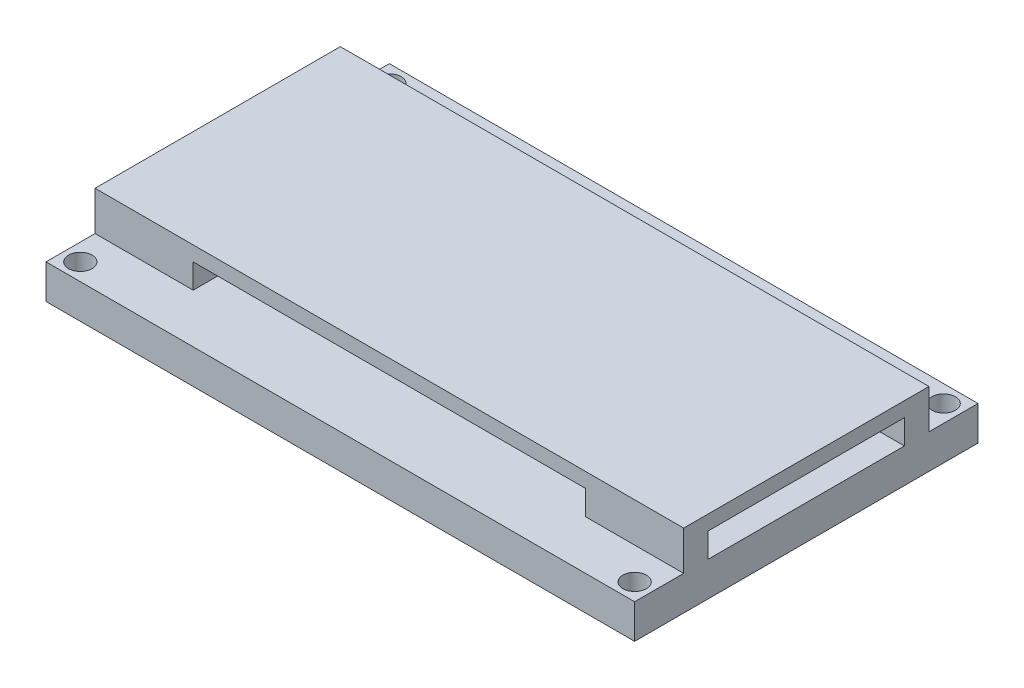
ISO-10303-21;
HEADER;
FILE_DESCRIPTION(('STEP AP214'),'2;1');
FILE_NAME('part.step','',(''),(''),'','','');
FILE_SCHEMA(('AUTOMOTIVE_DESIGN { 1 0 10303 214 1 1 1 1 }'));
ENDSEC;
DATA;
#1=APPLICATION_CONTEXT('core data for automotive mechanical design processes');
#2=APPLICATION_PROTOCOL_DEFINITION('international standard','automotive_design',2000,#1);
#3=PRODUCT_CONTEXT('',#1,'mechanical');
#4=PRODUCT('Part','Part','',(#3));
#5=PRODUCT_RELATED_PRODUCT_CATEGORY('part','',(#4));
#6=PRODUCT_DEFINITION_FORMATION('','',#4);
#7=PRODUCT_DEFINITION_CONTEXT('part definition',#1,'design');
#8=PRODUCT_DEFINITION('design','',#6,#7);
#9=PRODUCT_DEFINITION_SHAPE('','',#8);
#10=(LENGTH_UNIT() NAMED_UNIT(*) SI_UNIT(.MILLI.,.METRE.));
#11=(NAMED_UNIT(*) PLANE_ANGLE_UNIT() SI_UNIT($,.RADIAN.));
#12=(NAMED_UNIT(*) SI_UNIT($,.STERADIAN.) SOLID_ANGLE_UNIT());
#13=UNCERTAINTY_MEASURE_WITH_UNIT(LENGTH_MEASURE(1.E-05),#10,'distance_accuracy_value','');
#14=(GEOMETRIC_REPRESENTATION_CONTEXT(3) GLOBAL_UNCERTAINTY_ASSIGNED_CONTEXT((#13)) GLOBAL_UNIT_ASSIGNED_CONTEXT((#10,
#11,#12)) REPRESENTATION_CONTEXT('',''));
#15=CARTESIAN_POINT('',(0.,0.,0.));
#16=DIRECTION('',(0.,0.,1.));
#17=DIRECTION('',(1.,0.,0.));
#18=AXIS2_PLACEMENT_3D('',#15,#16,#17);
#19=CARTESIAN_POINT('',(60.,12.,-20.));
#20=DIRECTION('',(0.,0.,-1.));
#21=DIRECTION('',(-1.,0.,0.));
#22=AXIS2_PLACEMENT_3D('',#19,#20,#21);
#23=PLANE('',#22);
#24=DIRECTION('',(1.,0.,0.));
#25=VECTOR('',#24,1.);
#26=CARTESIAN_POINT('',(60.,7.,-20.));
#27=LINE('',#26,#25);
#28=CARTESIAN_POINT('',(-60.,7.,-20.));
#29=VERTEX_POINT('',#28);
#30=CARTESIAN_POINT('',(-40.,7.,-20.));
#31=VERTEX_POINT('',#30);
#32=EDGE_CURVE('E236',#29,#31,#27,.T.);
#33=ORIENTED_EDGE('',*,*,#32,.T.);
#34=DIRECTION('',(0.,1.,0.));
#35=VECTOR('',#34,1.);
#36=CARTESIAN_POINT('',(-40.,12.,-20.));
#37=LINE('',#36,#35);
#38=CARTESIAN_POINT('',(-40.,12.,-20.));
#39=VERTEX_POINT('',#38);
#40=EDGE_CURVE('E403',#31,#39,#37,.T.);
#41=ORIENTED_EDGE('',*,*,#40,.T.);
#42=DIRECTION('',(1.,0.,0.));
#43=VECTOR('',#42,1.);
#44=CARTESIAN_POINT('',(60.,12.,-20.));
#45=LINE('',#44,#43);
#46=CARTESIAN_POINT('',(-60.,12.,-20.));
#47=VERTEX_POINT('',#46);
#48=EDGE_CURVE('E230',#47,#39,#45,.T.);
#49=ORIENTED_EDGE('',*,*,#48,.F.);
#50=DIRECTION('',(0.,-1.,0.));
#51=VECTOR('',#50,1.);
#52=CARTESIAN_POINT('',(-60.,12.,-20.));
#53=LINE('',#52,#51);
#54=EDGE_CURVE('E256',#47,#29,#53,.T.);
#55=ORIENTED_EDGE('',*,*,#54,.T.);
#56=EDGE_LOOP('',(#33,#41,#49,#55));
#57=FACE_BOUND('',#56,.T.);
#58=ADVANCED_FACE('F39',(#57),#23,.F.);
#59=CARTESIAN_POINT('',(60.,12.,20.));
#60=DIRECTION('',(0.,0.,1.));
#61=DIRECTION('',(1.,0.,0.));
#62=AXIS2_PLACEMENT_3D('',#59,#60,#61);
#63=PLANE('',#62);
#64=DIRECTION('',(-1.,0.,0.));
#65=VECTOR('',#64,1.);
#66=CARTESIAN_POINT('',(60.,12.,20.));
#67=LINE('',#66,#65);
#68=CARTESIAN_POINT('',(-40.,12.,20.));
#69=VERTEX_POINT('',#68);
#70=CARTESIAN_POINT('',(-60.,12.,20.));
#71=VERTEX_POINT('',#70);
#72=EDGE_CURVE('E210',#69,#71,#67,.T.);
#73=ORIENTED_EDGE('',*,*,#72,.F.);
#74=DIRECTION('',(0.,-1.,0.));
#75=VECTOR('',#74,1.);
#76=CARTESIAN_POINT('',(-40.,12.,20.));
#77=LINE('',#76,#75);
#78=CARTESIAN_POINT('',(-40.,7.,20.));
#79=VERTEX_POINT('',#78);
#80=EDGE_CURVE('E424',#69,#79,#77,.T.);
#81=ORIENTED_EDGE('',*,*,#80,.T.);
#82=DIRECTION('',(-1.,0.,0.));
#83=VECTOR('',#82,1.);
#84=CARTESIAN_POINT('',(60.,7.,20.));
#85=LINE('',#84,#83);
#86=CARTESIAN_POINT('',(-60.,7.,20.));
#87=VERTEX_POINT('',#86);
#88=EDGE_CURVE('E211',#79,#87,#85,.T.);
#89=ORIENTED_EDGE('',*,*,#88,.T.);
#90=DIRECTION('',(0.,-1.,0.));
#91=VECTOR('',#90,1.);
#92=CARTESIAN_POINT('',(-60.,12.,20.));
#93=LINE('',#92,#91);
#94=EDGE_CURVE('E222',#71,#87,#93,.T.);
#95=ORIENTED_EDGE('',*,*,#94,.F.);
#96=EDGE_LOOP('',(#73,#81,#89,#95));
#97=FACE_BOUND('',#96,.T.);
#98=ADVANCED_FACE('F395',(#97),#63,.F.);
#99=CARTESIAN_POINT('',(0.,7.,0.));
#100=DIRECTION('',(0.,1.,0.));
#101=DIRECTION('',(0.,0.,1.));
#102=AXIS2_PLACEMENT_3D('',#99,#100,#101);
#103=PLANE('',#102);
#104=DIRECTION('',(-1.,0.,0.));
#105=VECTOR('',#104,1.);
#106=CARTESIAN_POINT('',(-60.,7.,-35.));
#107=LINE('',#106,#105);
#108=CARTESIAN_POINT('',(60.,7.,-35.));
#109=VERTEX_POINT('',#108);
#110=CARTESIAN_POINT('',(-60.,7.,-35.));
#111=VERTEX_POINT('',#110);
#112=EDGE_CURVE('E295',#109,#111,#107,.T.);
#113=ORIENTED_EDGE('',*,*,#112,.T.);
#114=DIRECTION('',(0.,0.,1.));
#115=VECTOR('',#114,1.);
#116=CARTESIAN_POINT('',(-60.,7.,-35.));
#117=LINE('',#116,#115);
#118=CARTESIAN_POINT('',(-60.,7.,-25.));
#119=VERTEX_POINT('',#118);
#120=EDGE_CURVE('E301',#111,#119,#117,.T.);
#121=ORIENTED_EDGE('',*,*,#120,.T.);
#122=DIRECTION('',(-1.,0.,0.));
#123=VECTOR('',#122,1.);
#124=CARTESIAN_POINT('',(-60.,7.,-25.));
#125=LINE('',#124,#123);
#126=CARTESIAN_POINT('',(-40.,7.,-25.));
#127=VERTEX_POINT('',#126);
#128=EDGE_CURVE('E240',#127,#119,#125,.T.);
#129=ORIENTED_EDGE('',*,*,#128,.F.);
#130=DIRECTION('',(0.,0.,1.));
#131=VECTOR('',#130,1.);
#132=CARTESIAN_POINT('',(-40.,7.,-35.));
#133=LINE('',#132,#131);
#134=EDGE_CURVE('E55',#127,#31,#133,.T.);
#135=ORIENTED_EDGE('',*,*,#134,.T.);
#136=ORIENTED_EDGE('',*,*,#32,.F.);
#137=EDGE_CURVE('E306',#29,#87,#117,.T.);
#138=ORIENTED_EDGE('',*,*,#137,.T.);
#139=ORIENTED_EDGE('',*,*,#88,.F.);
#140=CARTESIAN_POINT('',(-40.,7.,25.));
#141=VERTEX_POINT('',#140);
#142=EDGE_CURVE('E435',#79,#141,#133,.T.);
#143=ORIENTED_EDGE('',*,*,#142,.T.);
#144=DIRECTION('',(1.,0.,0.));
#145=VECTOR('',#144,1.);
#146=CARTESIAN_POINT('',(-60.,7.,25.));
#147=LINE('',#146,#145);
#148=CARTESIAN_POINT('',(-60.,7.,25.));
#149=VERTEX_POINT('',#148);
#150=EDGE_CURVE('E205',#149,#141,#147,.T.);
#151=ORIENTED_EDGE('',*,*,#150,.F.);
#152=CARTESIAN_POINT('',(-60.,7.,35.));
#153=VERTEX_POINT('',#152);
#154=EDGE_CURVE('E300',#149,#153,#117,.T.);
#155=ORIENTED_EDGE('',*,*,#154,.T.);
#156=DIRECTION('',(1.,0.,0.));
#157=VECTOR('',#156,1.);
#158=CARTESIAN_POINT('',(-60.,7.,35.));
#159=LINE('',#158,#157);
#160=CARTESIAN_POINT('',(60.,7.,35.));
#161=VERTEX_POINT('',#160);
#162=EDGE_CURVE('E305',#153,#161,#159,.T.);
#163=ORIENTED_EDGE('',*,*,#162,.T.);
#164=DIRECTION('',(0.,0.,-1.));
#165=VECTOR('',#164,1.);
#166=CARTESIAN_POINT('',(60.,7.,-35.));
#167=LINE('',#166,#165);
#168=CARTESIAN_POINT('',(60.,7.,25.));
#169=VERTEX_POINT('',#168);
#170=EDGE_CURVE('E203',#161,#169,#167,.T.);
#171=ORIENTED_EDGE('',*,*,#170,.T.);
#172=CARTESIAN_POINT('',(40.,7.,25.));
#173=VERTEX_POINT('',#172);
#174=EDGE_CURVE('E191',#173,#169,#147,.T.);
#175=ORIENTED_EDGE('',*,*,#174,.F.);
#176=DIRECTION('',(0.,0.,1.));
#177=VECTOR('',#176,1.);
#178=CARTESIAN_POINT('',(40.,7.,-35.));
#179=LINE('',#178,#177);
#180=CARTESIAN_POINT('',(40.,7.,20.));
#181=VERTEX_POINT('',#180);
#182=EDGE_CURVE('E176',#181,#173,#179,.T.);
#183=ORIENTED_EDGE('',*,*,#182,.F.);
#184=CARTESIAN_POINT('',(60.,7.,20.));
#185=VERTEX_POINT('',#184);
#186=EDGE_CURVE('E206',#185,#181,#85,.T.);
#187=ORIENTED_EDGE('',*,*,#186,.F.);
#188=CARTESIAN_POINT('',(60.,7.,-20.));
#189=VERTEX_POINT('',#188);
#190=EDGE_CURVE('E296',#185,#189,#167,.T.);
#191=ORIENTED_EDGE('',*,*,#190,.T.);
#192=CARTESIAN_POINT('',(40.,7.,-20.));
#193=VERTEX_POINT('',#192);
#194=EDGE_CURVE('E229',#193,#189,#27,.T.);
#195=ORIENTED_EDGE('',*,*,#194,.F.);
#196=CARTESIAN_POINT('',(40.,7.,-25.));
#197=VERTEX_POINT('',#196);
#198=EDGE_CURVE('E62',#197,#193,#179,.T.);
#199=ORIENTED_EDGE('',*,*,#198,.F.);
#200=CARTESIAN_POINT('',(60.,7.,-25.));
#201=VERTEX_POINT('',#200);
#202=EDGE_CURVE('E241',#201,#197,#125,.T.);
#203=ORIENTED_EDGE('',*,*,#202,.F.);
#204=EDGE_CURVE('E297',#201,#109,#167,.T.);
#205=ORIENTED_EDGE('',*,*,#204,.T.);
#206=EDGE_LOOP('',(#113,#121,#129,#135,#136,#138,#139,#143,#151,#155,#163,#171,#175,#183,#187,
#191,#195,#199,#203,#205));
#207=FACE_BOUND('',#206,.T.);
#208=CARTESIAN_POINT('',(56.5,7.,-31.5));
#209=DIRECTION('',(0.,1.,0.));
#210=DIRECTION('',(0.,0.,1.));
#211=AXIS2_PLACEMENT_3D('',#208,#209,#210);
#212=CIRCLE('',#211,2.39999999999999);
#213=CARTESIAN_POINT('',(56.5,7.,-29.1));
#214=VERTEX_POINT('',#213);
#215=EDGE_CURVE('E260',#214,#214,#212,.T.);
#216=ORIENTED_EDGE('',*,*,#215,.F.);
#217=EDGE_LOOP('',(#216));
#218=FACE_BOUND('',#217,.T.);
#219=CARTESIAN_POINT('',(56.5,7.,31.5));
#220=DIRECTION('',(0.,1.,0.));
#221=DIRECTION('',(0.,0.,1.));
#222=AXIS2_PLACEMENT_3D('',#219,#220,#221);
#223=CIRCLE('',#222,2.39999999999999);
#224=CARTESIAN_POINT('',(56.5,7.,33.9));
#225=VERTEX_POINT('',#224);
#226=EDGE_CURVE('E268',#225,#225,#223,.T.);
#227=ORIENTED_EDGE('',*,*,#226,.F.);
#228=EDGE_LOOP('',(#227));
#229=FACE_BOUND('',#228,.T.);
#230=CARTESIAN_POINT('',(-56.5,7.,31.5));
#231=DIRECTION('',(0.,1.,0.));
#232=DIRECTION('',(0.,0.,1.));
#233=AXIS2_PLACEMENT_3D('',#230,#231,#232);
#234=CIRCLE('',#233,2.39999999999999);
#235=CARTESIAN_POINT('',(-56.5,7.,33.9));
#236=VERTEX_POINT('',#235);
#237=EDGE_CURVE('E276',#236,#236,#234,.T.);
#238=ORIENTED_EDGE('',*,*,#237,.F.);
#239=EDGE_LOOP('',(#238));
#240=FACE_BOUND('',#239,.T.);
#241=CARTESIAN_POINT('',(-56.5,7.,-31.5));
#242=DIRECTION('',(0.,1.,0.));
#243=DIRECTION('',(0.,0.,1.));
#244=AXIS2_PLACEMENT_3D('',#241,#242,#243);
#245=CIRCLE('',#244,2.39999999999999);
#246=CARTESIAN_POINT('',(-56.5,7.,-29.1));
#247=VERTEX_POINT('',#246);
#248=EDGE_CURVE('E284',#247,#247,#245,.T.);
#249=ORIENTED_EDGE('',*,*,#248,.F.);
#250=EDGE_LOOP('',(#249));
#251=FACE_BOUND('',#250,.T.);
#252=ADVANCED_FACE('F200',(#207,#218,#229,#240,#251),#103,.T.);
#253=CARTESIAN_POINT('',(60.,7.,-35.));
#254=DIRECTION('',(-1.,0.,0.));
#255=DIRECTION('',(0.,0.,1.));
#256=AXIS2_PLACEMENT_3D('',#253,#254,#255);
#257=PLANE('',#256);
#258=DIRECTION('',(0.,-1.,0.));
#259=VECTOR('',#258,1.);
#260=CARTESIAN_POINT('',(60.,12.,-25.));
#261=LINE('',#260,#259);
#262=CARTESIAN_POINT('',(60.,15.,-25.));
#263=VERTEX_POINT('',#262);
#264=EDGE_CURVE('E248',#263,#201,#261,.T.);
#265=ORIENTED_EDGE('',*,*,#264,.F.);
#266=DIRECTION('',(0.,0.,-1.));
#267=VECTOR('',#266,1.);
#268=CARTESIAN_POINT('',(60.,15.,-25.));
#269=LINE('',#268,#267);
#270=CARTESIAN_POINT('',(60.,15.,25.));
#271=VERTEX_POINT('',#270);
#272=EDGE_CURVE('E351',#271,#263,#269,.T.);
#273=ORIENTED_EDGE('',*,*,#272,.F.);
#274=DIRECTION('',(0.,-1.,0.));
#275=VECTOR('',#274,1.);
#276=CARTESIAN_POINT('',(60.,12.,25.));
#277=LINE('',#276,#275);
#278=EDGE_CURVE('E215',#271,#169,#277,.T.);
#279=ORIENTED_EDGE('',*,*,#278,.T.);
#280=ORIENTED_EDGE('',*,*,#170,.F.);
#281=DIRECTION('',(0.,-1.,0.));
#282=VECTOR('',#281,1.);
#283=CARTESIAN_POINT('',(60.,7.,35.));
#284=LINE('',#283,#282);
#285=CARTESIAN_POINT('',(60.,0.,35.));
#286=VERTEX_POINT('',#285);
#287=EDGE_CURVE('E309',#161,#286,#284,.T.);
#288=ORIENTED_EDGE('',*,*,#287,.T.);
#289=DIRECTION('',(0.,0.,-1.));
#290=VECTOR('',#289,1.);
#291=CARTESIAN_POINT('',(60.,0.,-35.));
#292=LINE('',#291,#290);
#293=CARTESIAN_POINT('',(60.,0.,-35.));
#294=VERTEX_POINT('',#293);
#295=EDGE_CURVE('E292',#286,#294,#292,.T.);
#296=ORIENTED_EDGE('',*,*,#295,.T.);
#297=DIRECTION('',(0.,-1.,0.));
#298=VECTOR('',#297,1.);
#299=CARTESIAN_POINT('',(60.,7.,-35.));
#300=LINE('',#299,#298);
#301=EDGE_CURVE('E11',#109,#294,#300,.T.);
#302=ORIENTED_EDGE('',*,*,#301,.F.);
#303=ORIENTED_EDGE('',*,*,#204,.F.);
#304=EDGE_LOOP('',(#265,#273,#279,#280,#288,#296,#302,#303));
#305=FACE_BOUND('',#304,.T.);
#306=DIRECTION('',(0.,0.,-1.));
#307=VECTOR('',#306,1.);
#308=CARTESIAN_POINT('',(60.,12.,-25.));
#309=LINE('',#308,#307);
#310=CARTESIAN_POINT('',(60.,12.,20.));
#311=VERTEX_POINT('',#310);
#312=CARTESIAN_POINT('',(60.,12.,-20.));
#313=VERTEX_POINT('',#312);
#314=EDGE_CURVE('E368',#311,#313,#309,.T.);
#315=ORIENTED_EDGE('',*,*,#314,.T.);
#316=DIRECTION('',(0.,-1.,0.));
#317=VECTOR('',#316,1.);
#318=CARTESIAN_POINT('',(60.,12.,-20.));
#319=LINE('',#318,#317);
#320=EDGE_CURVE('E252',#313,#189,#319,.T.);
#321=ORIENTED_EDGE('',*,*,#320,.T.);
#322=ORIENTED_EDGE('',*,*,#190,.F.);
#323=DIRECTION('',(0.,-1.,0.));
#324=VECTOR('',#323,1.);
#325=CARTESIAN_POINT('',(60.,12.,20.));
#326=LINE('',#325,#324);
#327=EDGE_CURVE('E226',#311,#185,#326,.T.);
#328=ORIENTED_EDGE('',*,*,#327,.F.);
#329=EDGE_LOOP('',(#315,#321,#322,#328));
#330=FACE_BOUND('',#329,.T.);
#331=ADVANCED_FACE('F41',(#305,#330),#257,.F.);
#332=CARTESIAN_POINT('',(-60.,7.,-35.));
#333=DIRECTION('',(0.,0.,1.));
#334=DIRECTION('',(1.,0.,0.));
#335=AXIS2_PLACEMENT_3D('',#332,#333,#334);
#336=PLANE('',#335);
#337=DIRECTION('',(-1.,0.,0.));
#338=VECTOR('',#337,1.);
#339=CARTESIAN_POINT('',(-60.,0.,-35.));
#340=LINE('',#339,#338);
#341=CARTESIAN_POINT('',(-60.,0.,-35.));
#342=VERTEX_POINT('',#341);
#343=EDGE_CURVE('E313',#294,#342,#340,.T.);
#344=ORIENTED_EDGE('',*,*,#343,.T.);
#345=DIRECTION('',(0.,-1.,0.));
#346=VECTOR('',#345,1.);
#347=CARTESIAN_POINT('',(-60.,7.,-35.));
#348=LINE('',#347,#346);
#349=EDGE_CURVE('E48',#111,#342,#348,.T.);
#350=ORIENTED_EDGE('',*,*,#349,.F.);
#351=ORIENTED_EDGE('',*,*,#112,.F.);
#352=ORIENTED_EDGE('',*,*,#301,.T.);
#353=EDGE_LOOP('',(#344,#350,#351,#352));
#354=FACE_BOUND('',#353,.T.);
#355=ADVANCED_FACE('F470',(#354),#336,.F.);
#356=CARTESIAN_POINT('',(-60.,7.,-35.));
#357=DIRECTION('',(1.,0.,0.));
#358=DIRECTION('',(0.,0.,-1.));
#359=AXIS2_PLACEMENT_3D('',#356,#357,#358);
#360=PLANE('',#359);
#361=ORIENTED_EDGE('',*,*,#54,.F.);
#362=DIRECTION('',(0.,0.,1.));
#363=VECTOR('',#362,1.);
#364=CARTESIAN_POINT('',(-60.,12.,-25.));
#365=LINE('',#364,#363);
#366=EDGE_CURVE('E374',#47,#71,#365,.T.);
#367=ORIENTED_EDGE('',*,*,#366,.T.);
#368=ORIENTED_EDGE('',*,*,#94,.T.);
#369=ORIENTED_EDGE('',*,*,#137,.F.);
#370=EDGE_LOOP('',(#361,#367,#368,#369));
#371=FACE_BOUND('',#370,.T.);
#372=DIRECTION('',(0.,0.,1.));
#373=VECTOR('',#372,1.);
#374=CARTESIAN_POINT('',(-60.,0.,-35.));
#375=LINE('',#374,#373);
#376=CARTESIAN_POINT('',(-60.,0.,35.));
#377=VERTEX_POINT('',#376);
#378=EDGE_CURVE('E316',#342,#377,#375,.T.);
#379=ORIENTED_EDGE('',*,*,#378,.T.);
#380=DIRECTION('',(0.,-1.,0.));
#381=VECTOR('',#380,1.);
#382=CARTESIAN_POINT('',(-60.,7.,35.));
#383=LINE('',#382,#381);
#384=EDGE_CURVE('E325',#153,#377,#383,.T.);
#385=ORIENTED_EDGE('',*,*,#384,.F.);
#386=ORIENTED_EDGE('',*,*,#154,.F.);
#387=DIRECTION('',(0.,-1.,0.));
#388=VECTOR('',#387,1.);
#389=CARTESIAN_POINT('',(-60.,12.,25.));
#390=LINE('',#389,#388);
#391=CARTESIAN_POINT('',(-60.,15.,25.));
#392=VERTEX_POINT('',#391);
#393=EDGE_CURVE('E218',#392,#149,#390,.T.);
#394=ORIENTED_EDGE('',*,*,#393,.F.);
#395=DIRECTION('',(0.,0.,1.));
#396=VECTOR('',#395,1.);
#397=CARTESIAN_POINT('',(-60.,15.,-25.));
#398=LINE('',#397,#396);
#399=CARTESIAN_POINT('',(-60.,15.,-25.));
#400=VERTEX_POINT('',#399);
#401=EDGE_CURVE('E361',#400,#392,#398,.T.);
#402=ORIENTED_EDGE('',*,*,#401,.F.);
#403=DIRECTION('',(0.,-1.,0.));
#404=VECTOR('',#403,1.);
#405=CARTESIAN_POINT('',(-60.,12.,-25.));
#406=LINE('',#405,#404);
#407=EDGE_CURVE('E234',#400,#119,#406,.T.);
#408=ORIENTED_EDGE('',*,*,#407,.T.);
#409=ORIENTED_EDGE('',*,*,#120,.F.);
#410=ORIENTED_EDGE('',*,*,#349,.T.);
#411=EDGE_LOOP('',(#379,#385,#386,#394,#402,#408,#409,#410));
#412=FACE_BOUND('',#411,.T.);
#413=ADVANCED_FACE('F334',(#371,#412),#360,.F.);
#414=CARTESIAN_POINT('',(-60.,7.,35.));
#415=DIRECTION('',(0.,0.,-1.));
#416=DIRECTION('',(-1.,0.,0.));
#417=AXIS2_PLACEMENT_3D('',#414,#415,#416);
#418=PLANE('',#417);
#419=DIRECTION('',(1.,0.,0.));
#420=VECTOR('',#419,1.);
#421=CARTESIAN_POINT('',(-60.,0.,35.));
#422=LINE('',#421,#420);
#423=EDGE_CURVE('E319',#377,#286,#422,.T.);
#424=ORIENTED_EDGE('',*,*,#423,.T.);
#425=ORIENTED_EDGE('',*,*,#287,.F.);
#426=ORIENTED_EDGE('',*,*,#162,.F.);
#427=ORIENTED_EDGE('',*,*,#384,.T.);
#428=EDGE_LOOP('',(#424,#425,#426,#427));
#429=FACE_BOUND('',#428,.T.);
#430=ADVANCED_FACE('F344',(#429),#418,.F.);
#431=CARTESIAN_POINT('',(0.,0.,0.));
#432=DIRECTION('',(0.,1.,0.));
#433=DIRECTION('',(0.,0.,1.));
#434=AXIS2_PLACEMENT_3D('',#431,#432,#433);
#435=PLANE('',#434);
#436=CARTESIAN_POINT('',(56.5,0.,-31.5));
#437=DIRECTION('',(0.,1.,0.));
#438=DIRECTION('',(0.,0.,1.));
#439=AXIS2_PLACEMENT_3D('',#436,#437,#438);
#440=CIRCLE('',#439,2.4);
#441=CARTESIAN_POINT('',(56.5,0.,-29.1));
#442=VERTEX_POINT('',#441);
#443=EDGE_CURVE('E264',#442,#442,#440,.T.);
#444=ORIENTED_EDGE('',*,*,#443,.T.);
#445=EDGE_LOOP('',(#444));
#446=FACE_BOUND('',#445,.T.);
#447=CARTESIAN_POINT('',(56.5,0.,31.5));
#448=DIRECTION('',(0.,1.,0.));
#449=DIRECTION('',(0.,0.,1.));
#450=AXIS2_PLACEMENT_3D('',#447,#448,#449);
#451=CIRCLE('',#450,2.4);
#452=CARTESIAN_POINT('',(56.5,0.,33.9));
#453=VERTEX_POINT('',#452);
#454=EDGE_CURVE('E272',#453,#453,#451,.T.);
#455=ORIENTED_EDGE('',*,*,#454,.T.);
#456=EDGE_LOOP('',(#455));
#457=FACE_BOUND('',#456,.T.);
#458=CARTESIAN_POINT('',(-56.5,0.,31.5));
#459=DIRECTION('',(0.,1.,0.));
#460=DIRECTION('',(0.,0.,1.));
#461=AXIS2_PLACEMENT_3D('',#458,#459,#460);
#462=CIRCLE('',#461,2.4);
#463=CARTESIAN_POINT('',(-56.5,0.,33.9));
#464=VERTEX_POINT('',#463);
#465=EDGE_CURVE('E280',#464,#464,#462,.T.);
#466=ORIENTED_EDGE('',*,*,#465,.T.);
#467=EDGE_LOOP('',(#466));
#468=FACE_BOUND('',#467,.T.);
#469=CARTESIAN_POINT('',(-56.5,0.,-31.5));
#470=DIRECTION('',(0.,1.,0.));
#471=DIRECTION('',(0.,0.,1.));
#472=AXIS2_PLACEMENT_3D('',#469,#470,#471);
#473=CIRCLE('',#472,2.4);
#474=CARTESIAN_POINT('',(-56.5,0.,-29.1));
#475=VERTEX_POINT('',#474);
#476=EDGE_CURVE('E288',#475,#475,#473,.T.);
#477=ORIENTED_EDGE('',*,*,#476,.T.);
#478=EDGE_LOOP('',(#477));
#479=FACE_BOUND('',#478,.T.);
#480=ORIENTED_EDGE('',*,*,#295,.F.);
#481=ORIENTED_EDGE('',*,*,#423,.F.);
#482=ORIENTED_EDGE('',*,*,#378,.F.);
#483=ORIENTED_EDGE('',*,*,#343,.F.);
#484=EDGE_LOOP('',(#480,#481,#482,#483));
#485=FACE_BOUND('',#484,.T.);
#486=ADVANCED_FACE('F341',(#446,#457,#468,#479,#485),#435,.F.);
#487=CARTESIAN_POINT('',(-56.5,7.,-31.5));
#488=DIRECTION('',(0.,1.,0.));
#489=DIRECTION('',(0.,0.,1.));
#490=AXIS2_PLACEMENT_3D('',#487,#488,#489);
#491=CYLINDRICAL_SURFACE('',#490,2.39999999999999);
#492=ORIENTED_EDGE('',*,*,#476,.F.);
#493=EDGE_LOOP('',(#492));
#494=FACE_BOUND('',#493,.T.);
#495=ORIENTED_EDGE('',*,*,#248,.T.);
#496=EDGE_LOOP('',(#495));
#497=FACE_BOUND('',#496,.T.);
#498=ADVANCED_FACE('F505',(#494,#497),#491,.F.);
#499=CARTESIAN_POINT('',(-56.5,7.,31.5));
#500=DIRECTION('',(0.,1.,0.));
#501=DIRECTION('',(0.,0.,1.));
#502=AXIS2_PLACEMENT_3D('',#499,#500,#501);
#503=CYLINDRICAL_SURFACE('',#502,2.39999999999999);
#504=ORIENTED_EDGE('',*,*,#465,.F.);
#505=EDGE_LOOP('',(#504));
#506=FACE_BOUND('',#505,.T.);
#507=ORIENTED_EDGE('',*,*,#237,.T.);
#508=EDGE_LOOP('',(#507));
#509=FACE_BOUND('',#508,.T.);
#510=ADVANCED_FACE('F497',(#506,#509),#503,.F.);
#511=CARTESIAN_POINT('',(56.5,7.,31.5));
#512=DIRECTION('',(0.,1.,0.));
#513=DIRECTION('',(0.,0.,1.));
#514=AXIS2_PLACEMENT_3D('',#511,#512,#513);
#515=CYLINDRICAL_SURFACE('',#514,2.39999999999999);
#516=ORIENTED_EDGE('',*,*,#454,.F.);
#517=EDGE_LOOP('',(#516));
#518=FACE_BOUND('',#517,.T.);
#519=ORIENTED_EDGE('',*,*,#226,.T.);
#520=EDGE_LOOP('',(#519));
#521=FACE_BOUND('',#520,.T.);
#522=ADVANCED_FACE('F492',(#518,#521),#515,.F.);
#523=CARTESIAN_POINT('',(56.5,7.,-31.5));
#524=DIRECTION('',(0.,1.,0.));
#525=DIRECTION('',(0.,0.,1.));
#526=AXIS2_PLACEMENT_3D('',#523,#524,#525);
#527=CYLINDRICAL_SURFACE('',#526,2.39999999999999);
#528=ORIENTED_EDGE('',*,*,#443,.F.);
#529=EDGE_LOOP('',(#528));
#530=FACE_BOUND('',#529,.T.);
#531=ORIENTED_EDGE('',*,*,#215,.T.);
#532=EDGE_LOOP('',(#531));
#533=FACE_BOUND('',#532,.T.);
#534=ADVANCED_FACE('F487',(#530,#533),#527,.F.);
#535=CARTESIAN_POINT('',(40.,12.,-20.));
#536=VERTEX_POINT('',#535);
#537=EDGE_CURVE('E235',#536,#313,#45,.T.);
#538=ORIENTED_EDGE('',*,*,#537,.F.);
#539=DIRECTION('',(0.,-1.,0.));
#540=VECTOR('',#539,1.);
#541=CARTESIAN_POINT('',(40.,12.,-20.));
#542=LINE('',#541,#540);
#543=EDGE_CURVE('E427',#536,#193,#542,.T.);
#544=ORIENTED_EDGE('',*,*,#543,.T.);
#545=ORIENTED_EDGE('',*,*,#194,.T.);
#546=ORIENTED_EDGE('',*,*,#320,.F.);
#547=EDGE_LOOP('',(#538,#544,#545,#546));
#548=FACE_BOUND('',#547,.T.);
#549=ADVANCED_FACE('F462',(#548),#23,.F.);
#550=CARTESIAN_POINT('',(-60.,12.,-25.));
#551=DIRECTION('',(0.,0.,1.));
#552=DIRECTION('',(1.,0.,0.));
#553=AXIS2_PLACEMENT_3D('',#550,#551,#552);
#554=PLANE('',#553);
#555=DIRECTION('',(-1.,0.,0.));
#556=VECTOR('',#555,1.);
#557=CARTESIAN_POINT('',(-60.,12.,-25.));
#558=LINE('',#557,#556);
#559=CARTESIAN_POINT('',(40.,12.,-25.));
#560=VERTEX_POINT('',#559);
#561=CARTESIAN_POINT('',(-40.,12.,-25.));
#562=VERTEX_POINT('',#561);
#563=EDGE_CURVE('E378',#560,#562,#558,.T.);
#564=ORIENTED_EDGE('',*,*,#563,.T.);
#565=DIRECTION('',(0.,-1.,0.));
#566=VECTOR('',#565,1.);
#567=CARTESIAN_POINT('',(-40.,12.,-25.));
#568=LINE('',#567,#566);
#569=EDGE_CURVE('E416',#562,#127,#568,.T.);
#570=ORIENTED_EDGE('',*,*,#569,.T.);
#571=ORIENTED_EDGE('',*,*,#128,.T.);
#572=ORIENTED_EDGE('',*,*,#407,.F.);
#573=DIRECTION('',(-1.,0.,0.));
#574=VECTOR('',#573,1.);
#575=CARTESIAN_POINT('',(-60.,15.,-25.));
#576=LINE('',#575,#574);
#577=EDGE_CURVE('E366',#263,#400,#576,.T.);
#578=ORIENTED_EDGE('',*,*,#577,.F.);
#579=ORIENTED_EDGE('',*,*,#264,.T.);
#580=ORIENTED_EDGE('',*,*,#202,.T.);
#581=DIRECTION('',(0.,1.,0.));
#582=VECTOR('',#581,1.);
#583=CARTESIAN_POINT('',(40.,12.,-25.));
#584=LINE('',#583,#582);
#585=EDGE_CURVE('E417',#197,#560,#584,.T.);
#586=ORIENTED_EDGE('',*,*,#585,.T.);
#587=EDGE_LOOP('',(#564,#570,#571,#572,#578,#579,#580,#586));
#588=FACE_BOUND('',#587,.T.);
#589=ADVANCED_FACE('F415',(#588),#554,.F.);
#590=ORIENTED_EDGE('',*,*,#186,.T.);
#591=DIRECTION('',(0.,1.,0.));
#592=VECTOR('',#591,1.);
#593=CARTESIAN_POINT('',(40.,12.,20.));
#594=LINE('',#593,#592);
#595=CARTESIAN_POINT('',(40.,12.,20.));
#596=VERTEX_POINT('',#595);
#597=EDGE_CURVE('E182',#181,#596,#594,.T.);
#598=ORIENTED_EDGE('',*,*,#597,.T.);
#599=EDGE_CURVE('E219',#311,#596,#67,.T.);
#600=ORIENTED_EDGE('',*,*,#599,.F.);
#601=ORIENTED_EDGE('',*,*,#327,.T.);
#602=EDGE_LOOP('',(#590,#598,#600,#601));
#603=FACE_BOUND('',#602,.T.);
#604=ADVANCED_FACE('F483',(#603),#63,.F.);
#605=CARTESIAN_POINT('',(-60.,12.,25.));
#606=DIRECTION('',(0.,0.,-1.));
#607=DIRECTION('',(-1.,0.,0.));
#608=AXIS2_PLACEMENT_3D('',#605,#606,#607);
#609=PLANE('',#608);
#610=ORIENTED_EDGE('',*,*,#150,.T.);
#611=DIRECTION('',(0.,-1.,0.));
#612=VECTOR('',#611,1.);
#613=CARTESIAN_POINT('',(-40.,7.,25.));
#614=LINE('',#613,#612);
#615=CARTESIAN_POINT('',(-40.,12.,25.));
#616=VERTEX_POINT('',#615);
#617=EDGE_CURVE('E197',#616,#141,#614,.T.);
#618=ORIENTED_EDGE('',*,*,#617,.F.);
#619=DIRECTION('',(-1.,0.,0.));
#620=VECTOR('',#619,1.);
#621=CARTESIAN_POINT('',(-40.,12.,25.));
#622=LINE('',#621,#620);
#623=CARTESIAN_POINT('',(40.,12.,25.));
#624=VERTEX_POINT('',#623);
#625=EDGE_CURVE('E195',#624,#616,#622,.T.);
#626=ORIENTED_EDGE('',*,*,#625,.F.);
#627=DIRECTION('',(0.,1.,0.));
#628=VECTOR('',#627,1.);
#629=CARTESIAN_POINT('',(40.,7.,25.));
#630=LINE('',#629,#628);
#631=EDGE_CURVE('E179',#173,#624,#630,.T.);
#632=ORIENTED_EDGE('',*,*,#631,.F.);
#633=ORIENTED_EDGE('',*,*,#174,.T.);
#634=ORIENTED_EDGE('',*,*,#278,.F.);
#635=DIRECTION('',(1.,0.,0.));
#636=VECTOR('',#635,1.);
#637=CARTESIAN_POINT('',(-60.,15.,25.));
#638=LINE('',#637,#636);
#639=EDGE_CURVE('E354',#392,#271,#638,.T.);
#640=ORIENTED_EDGE('',*,*,#639,.F.);
#641=ORIENTED_EDGE('',*,*,#393,.T.);
#642=EDGE_LOOP('',(#610,#618,#626,#632,#633,#634,#640,#641));
#643=FACE_BOUND('',#642,.T.);
#644=ADVANCED_FACE('F190',(#643),#609,.F.);
#645=CARTESIAN_POINT('',(0.,12.,0.));
#646=DIRECTION('',(0.,1.,0.));
#647=DIRECTION('',(0.,0.,1.));
#648=AXIS2_PLACEMENT_3D('',#645,#646,#647);
#649=PLANE('',#648);
#650=ORIENTED_EDGE('',*,*,#599,.T.);
#651=DIRECTION('',(0.,0.,1.));
#652=VECTOR('',#651,1.);
#653=CARTESIAN_POINT('',(40.,12.,-35.));
#654=LINE('',#653,#652);
#655=EDGE_CURVE('E439',#596,#624,#654,.T.);
#656=ORIENTED_EDGE('',*,*,#655,.T.);
#657=ORIENTED_EDGE('',*,*,#625,.T.);
#658=DIRECTION('',(0.,0.,1.));
#659=VECTOR('',#658,1.);
#660=CARTESIAN_POINT('',(-40.,12.,-35.));
#661=LINE('',#660,#659);
#662=EDGE_CURVE('E392',#69,#616,#661,.T.);
#663=ORIENTED_EDGE('',*,*,#662,.F.);
#664=ORIENTED_EDGE('',*,*,#72,.T.);
#665=ORIENTED_EDGE('',*,*,#366,.F.);
#666=ORIENTED_EDGE('',*,*,#48,.T.);
#667=EDGE_CURVE('E405',#562,#39,#661,.T.);
#668=ORIENTED_EDGE('',*,*,#667,.F.);
#669=ORIENTED_EDGE('',*,*,#563,.F.);
#670=EDGE_CURVE('E441',#560,#536,#654,.T.);
#671=ORIENTED_EDGE('',*,*,#670,.T.);
#672=ORIENTED_EDGE('',*,*,#537,.T.);
#673=ORIENTED_EDGE('',*,*,#314,.F.);
#674=EDGE_LOOP('',(#650,#656,#657,#663,#664,#665,#666,#668,#669,#671,#672,#673));
#675=FACE_BOUND('',#674,.T.);
#676=ADVANCED_FACE('F391',(#675),#649,.F.);
#677=CARTESIAN_POINT('',(0.,15.,0.));
#678=DIRECTION('',(0.,1.,0.));
#679=DIRECTION('',(0.,0.,1.));
#680=AXIS2_PLACEMENT_3D('',#677,#678,#679);
#681=PLANE('',#680);
#682=ORIENTED_EDGE('',*,*,#401,.T.);
#683=ORIENTED_EDGE('',*,*,#639,.T.);
#684=ORIENTED_EDGE('',*,*,#272,.T.);
#685=ORIENTED_EDGE('',*,*,#577,.T.);
#686=EDGE_LOOP('',(#682,#683,#684,#685));
#687=FACE_BOUND('',#686,.T.);
#688=ADVANCED_FACE('F357',(#687),#681,.T.);
#689=CARTESIAN_POINT('',(40.,7.,-35.));
#690=DIRECTION('',(1.,0.,0.));
#691=DIRECTION('',(0.,0.,-1.));
#692=AXIS2_PLACEMENT_3D('',#689,#690,#691);
#693=PLANE('',#692);
#694=ORIENTED_EDGE('',*,*,#182,.T.);
#695=ORIENTED_EDGE('',*,*,#631,.T.);
#696=ORIENTED_EDGE('',*,*,#655,.F.);
#697=ORIENTED_EDGE('',*,*,#597,.F.);
#698=EDGE_LOOP('',(#694,#695,#696,#697));
#699=FACE_BOUND('',#698,.T.);
#700=ADVANCED_FACE('F178',(#699),#693,.F.);
#701=CARTESIAN_POINT('',(-40.,7.,-35.));
#702=DIRECTION('',(-1.,0.,0.));
#703=DIRECTION('',(0.,0.,1.));
#704=AXIS2_PLACEMENT_3D('',#701,#702,#703);
#705=PLANE('',#704);
#706=ORIENTED_EDGE('',*,*,#662,.T.);
#707=ORIENTED_EDGE('',*,*,#617,.T.);
#708=ORIENTED_EDGE('',*,*,#142,.F.);
#709=ORIENTED_EDGE('',*,*,#80,.F.);
#710=EDGE_LOOP('',(#706,#707,#708,#709));
#711=FACE_BOUND('',#710,.T.);
#712=ADVANCED_FACE('F448',(#711),#705,.F.);
#713=ORIENTED_EDGE('',*,*,#134,.F.);
#714=ORIENTED_EDGE('',*,*,#569,.F.);
#715=ORIENTED_EDGE('',*,*,#667,.T.);
#716=ORIENTED_EDGE('',*,*,#40,.F.);
#717=EDGE_LOOP('',(#713,#714,#715,#716));
#718=FACE_BOUND('',#717,.T.);
#719=ADVANCED_FACE('F637',(#718),#705,.F.);
#720=ORIENTED_EDGE('',*,*,#670,.F.);
#721=ORIENTED_EDGE('',*,*,#585,.F.);
#722=ORIENTED_EDGE('',*,*,#198,.T.);
#723=ORIENTED_EDGE('',*,*,#543,.F.);
#724=EDGE_LOOP('',(#720,#721,#722,#723));
#725=FACE_BOUND('',#724,.T.);
#726=ADVANCED_FACE('F468',(#725),#693,.F.);
#727=CLOSED_SHELL('',(#58,#98,#252,#331,#355,#413,#430,#486,#498,#510,#522,#534,#549,#589,#604,
#644,#676,#688,#700,#712,#719,#726));
#728=MANIFOLD_SOLID_BREP('B2',#727);
#729=ADVANCED_BREP_SHAPE_REPRESENTATION('',(#18,#728),#14);
#730=SHAPE_DEFINITION_REPRESENTATION(#9,#729);
ENDSEC;
END-ISO-10303-21;
